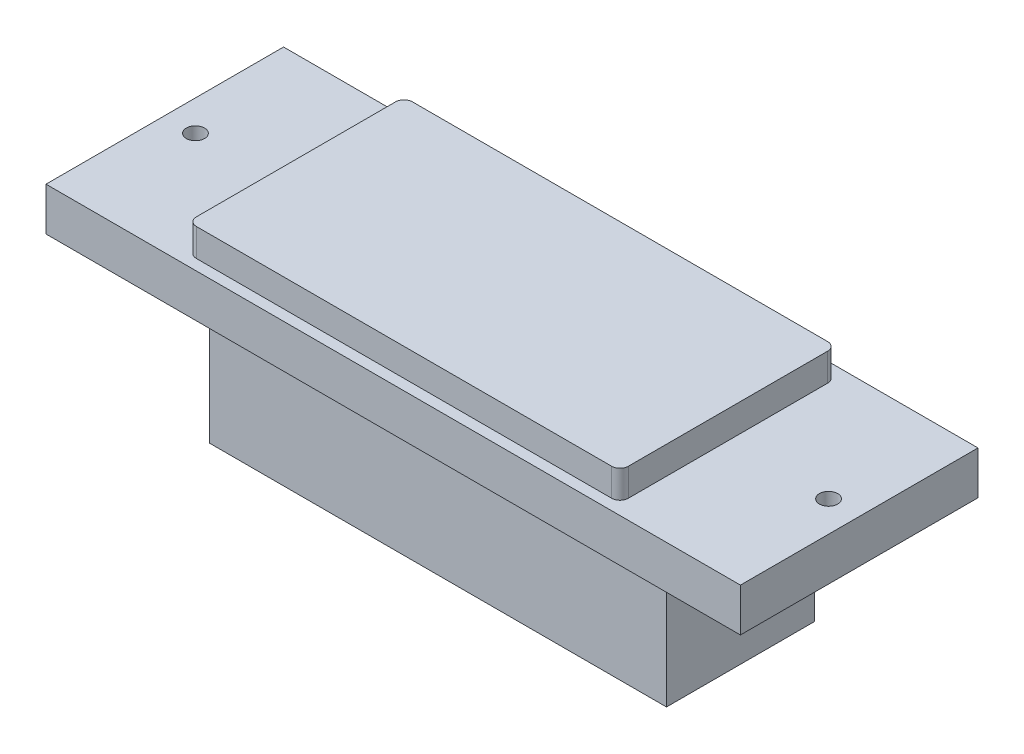
ISO-10303-21;
HEADER;
FILE_DESCRIPTION(('STEP AP214'),'2;1');
FILE_NAME('part.step','',(''),(''),'','','');
FILE_SCHEMA(('AUTOMOTIVE_DESIGN { 1 0 10303 214 1 1 1 1 }'));
ENDSEC;
DATA;
#1=APPLICATION_CONTEXT('core data for automotive mechanical design processes');
#2=APPLICATION_PROTOCOL_DEFINITION('international standard','automotive_design',2000,#1);
#3=PRODUCT_CONTEXT('',#1,'mechanical');
#4=PRODUCT('Part','Part','',(#3));
#5=PRODUCT_RELATED_PRODUCT_CATEGORY('part','',(#4));
#6=PRODUCT_DEFINITION_FORMATION('','',#4);
#7=PRODUCT_DEFINITION_CONTEXT('part definition',#1,'design');
#8=PRODUCT_DEFINITION('design','',#6,#7);
#9=PRODUCT_DEFINITION_SHAPE('','',#8);
#10=(LENGTH_UNIT() NAMED_UNIT(*) SI_UNIT(.MILLI.,.METRE.));
#11=(NAMED_UNIT(*) PLANE_ANGLE_UNIT() SI_UNIT($,.RADIAN.));
#12=(NAMED_UNIT(*) SI_UNIT($,.STERADIAN.) SOLID_ANGLE_UNIT());
#13=UNCERTAINTY_MEASURE_WITH_UNIT(LENGTH_MEASURE(1.E-05),#10,'distance_accuracy_value','');
#14=(GEOMETRIC_REPRESENTATION_CONTEXT(3) GLOBAL_UNCERTAINTY_ASSIGNED_CONTEXT((#13)) GLOBAL_UNIT_ASSIGNED_CONTEXT((#10,
#11,#12)) REPRESENTATION_CONTEXT('',''));
#15=CARTESIAN_POINT('',(0.,0.,0.));
#16=DIRECTION('',(0.,0.,1.));
#17=DIRECTION('',(1.,0.,0.));
#18=AXIS2_PLACEMENT_3D('',#15,#16,#17);
#19=CARTESIAN_POINT('',(0.,-6.604,0.));
#20=DIRECTION('',(0.,1.,0.));
#21=DIRECTION('',(0.,0.,1.));
#22=AXIS2_PLACEMENT_3D('',#19,#20,#21);
#23=PLANE('',#22);
#24=DIRECTION('',(0.,0.,-1.));
#25=VECTOR('',#24,1.);
#26=CARTESIAN_POINT('',(-53.086,-6.604,18.161));
#27=LINE('',#26,#25);
#28=CARTESIAN_POINT('',(-53.086,-6.604,18.161));
#29=VERTEX_POINT('',#28);
#30=CARTESIAN_POINT('',(-53.086,-6.604,-18.161));
#31=VERTEX_POINT('',#30);
#32=EDGE_CURVE('E184',#29,#31,#27,.T.);
#33=ORIENTED_EDGE('',*,*,#32,.T.);
#34=DIRECTION('',(1.,0.,0.));
#35=VECTOR('',#34,1.);
#36=CARTESIAN_POINT('',(53.086,-6.604,-18.161));
#37=LINE('',#36,#35);
#38=CARTESIAN_POINT('',(53.086,-6.604,-18.161));
#39=VERTEX_POINT('',#38);
#40=EDGE_CURVE('E187',#31,#39,#37,.T.);
#41=ORIENTED_EDGE('',*,*,#40,.T.);
#42=DIRECTION('',(0.,0.,1.));
#43=VECTOR('',#42,1.);
#44=CARTESIAN_POINT('',(53.086,-6.604,18.161));
#45=LINE('',#44,#43);
#46=CARTESIAN_POINT('',(53.086,-6.604,18.161));
#47=VERTEX_POINT('',#46);
#48=EDGE_CURVE('E190',#39,#47,#45,.T.);
#49=ORIENTED_EDGE('',*,*,#48,.T.);
#50=DIRECTION('',(-1.,0.,0.));
#51=VECTOR('',#50,1.);
#52=CARTESIAN_POINT('',(53.086,-6.604,18.161));
#53=LINE('',#52,#51);
#54=EDGE_CURVE('E192',#47,#29,#53,.T.);
#55=ORIENTED_EDGE('',*,*,#54,.T.);
#56=EDGE_LOOP('',(#33,#41,#49,#55));
#57=FACE_BOUND('',#56,.T.);
#58=CARTESIAN_POINT('',(48.3997,-6.604,0.));
#59=DIRECTION('',(0.,1.,0.));
#60=DIRECTION('',(0.,0.,1.));
#61=AXIS2_PLACEMENT_3D('',#58,#59,#60);
#62=CIRCLE('',#61,1.397);
#63=CARTESIAN_POINT('',(48.3997,-6.604,1.397));
#64=VERTEX_POINT('',#63);
#65=EDGE_CURVE('E180',#64,#64,#62,.T.);
#66=ORIENTED_EDGE('',*,*,#65,.T.);
#67=EDGE_LOOP('',(#66));
#68=FACE_BOUND('',#67,.T.);
#69=CARTESIAN_POINT('',(-48.3997,-6.604,0.));
#70=DIRECTION('',(0.,1.,0.));
#71=DIRECTION('',(0.,0.,1.));
#72=AXIS2_PLACEMENT_3D('',#69,#70,#71);
#73=CIRCLE('',#72,1.397);
#74=CARTESIAN_POINT('',(-48.3997,-6.604,1.397));
#75=VERTEX_POINT('',#74);
#76=EDGE_CURVE('E169',#75,#75,#73,.T.);
#77=ORIENTED_EDGE('',*,*,#76,.T.);
#78=EDGE_LOOP('',(#77));
#79=FACE_BOUND('',#78,.T.);
#80=DIRECTION('',(0.,0.,-1.));
#81=VECTOR('',#80,1.);
#82=CARTESIAN_POINT('',(-34.925,-6.604,11.303));
#83=LINE('',#82,#81);
#84=CARTESIAN_POINT('',(-34.925,-6.604,11.303));
#85=VERTEX_POINT('',#84);
#86=CARTESIAN_POINT('',(-34.925,-6.604,-11.303));
#87=VERTEX_POINT('',#86);
#88=EDGE_CURVE('E165',#85,#87,#83,.T.);
#89=ORIENTED_EDGE('',*,*,#88,.F.);
#90=DIRECTION('',(-1.,0.,0.));
#91=VECTOR('',#90,1.);
#92=CARTESIAN_POINT('',(34.925,-6.604,11.303));
#93=LINE('',#92,#91);
#94=CARTESIAN_POINT('',(34.925,-6.604,11.303));
#95=VERTEX_POINT('',#94);
#96=EDGE_CURVE('E162',#95,#85,#93,.T.);
#97=ORIENTED_EDGE('',*,*,#96,.F.);
#98=DIRECTION('',(0.,0.,1.));
#99=VECTOR('',#98,1.);
#100=CARTESIAN_POINT('',(34.925,-6.604,11.303));
#101=LINE('',#100,#99);
#102=CARTESIAN_POINT('',(34.925,-6.604,-11.303));
#103=VERTEX_POINT('',#102);
#104=EDGE_CURVE('E52',#103,#95,#101,.T.);
#105=ORIENTED_EDGE('',*,*,#104,.F.);
#106=DIRECTION('',(1.,0.,0.));
#107=VECTOR('',#106,1.);
#108=CARTESIAN_POINT('',(34.925,-6.604,-11.303));
#109=LINE('',#108,#107);
#110=EDGE_CURVE('E47',#87,#103,#109,.T.);
#111=ORIENTED_EDGE('',*,*,#110,.F.);
#112=EDGE_LOOP('',(#89,#97,#105,#111));
#113=FACE_BOUND('',#112,.T.);
#114=ADVANCED_FACE('F32',(#57,#68,#79,#113),#23,.F.);
#115=CARTESIAN_POINT('',(33.02,4.2418,-16.51));
#116=DIRECTION('',(-1.,0.,0.));
#117=DIRECTION('',(0.,0.,1.));
#118=AXIS2_PLACEMENT_3D('',#115,#116,#117);
#119=PLANE('',#118);
#120=DIRECTION('',(0.,0.,-1.));
#121=VECTOR('',#120,1.);
#122=CARTESIAN_POINT('',(33.02,4.2418,-16.51));
#123=LINE('',#122,#121);
#124=CARTESIAN_POINT('',(33.02,4.2418,15.24));
#125=VERTEX_POINT('',#124);
#126=CARTESIAN_POINT('',(33.02,4.2418,-15.24));
#127=VERTEX_POINT('',#126);
#128=EDGE_CURVE('E214',#125,#127,#123,.T.);
#129=ORIENTED_EDGE('',*,*,#128,.F.);
#130=DIRECTION('',(0.,-1.,0.));
#131=VECTOR('',#130,1.);
#132=CARTESIAN_POINT('',(33.02,4.2418,15.24));
#133=LINE('',#132,#131);
#134=CARTESIAN_POINT('',(33.02,0.,15.24));
#135=VERTEX_POINT('',#134);
#136=EDGE_CURVE('E236',#125,#135,#133,.T.);
#137=ORIENTED_EDGE('',*,*,#136,.T.);
#138=DIRECTION('',(0.,0.,-1.));
#139=VECTOR('',#138,1.);
#140=CARTESIAN_POINT('',(33.02,0.,-16.51));
#141=LINE('',#140,#139);
#142=CARTESIAN_POINT('',(33.02,0.,-15.24));
#143=VERTEX_POINT('',#142);
#144=EDGE_CURVE('E213',#135,#143,#141,.T.);
#145=ORIENTED_EDGE('',*,*,#144,.T.);
#146=DIRECTION('',(0.,-1.,0.));
#147=VECTOR('',#146,1.);
#148=CARTESIAN_POINT('',(33.02,4.2418,-15.24));
#149=LINE('',#148,#147);
#150=EDGE_CURVE('E227',#143,#127,#149,.F.);
#151=ORIENTED_EDGE('',*,*,#150,.T.);
#152=EDGE_LOOP('',(#129,#137,#145,#151));
#153=FACE_BOUND('',#152,.T.);
#154=ADVANCED_FACE('F294',(#153),#119,.F.);
#155=CARTESIAN_POINT('',(-33.02,4.2418,-16.51));
#156=DIRECTION('',(0.,0.,1.));
#157=DIRECTION('',(1.,0.,0.));
#158=AXIS2_PLACEMENT_3D('',#155,#156,#157);
#159=PLANE('',#158);
#160=DIRECTION('',(-1.,0.,0.));
#161=VECTOR('',#160,1.);
#162=CARTESIAN_POINT('',(-33.02,4.2418,-16.51));
#163=LINE('',#162,#161);
#164=CARTESIAN_POINT('',(31.75,4.2418,-16.51));
#165=VERTEX_POINT('',#164);
#166=CARTESIAN_POINT('',(-31.75,4.2418,-16.51));
#167=VERTEX_POINT('',#166);
#168=EDGE_CURVE('E217',#165,#167,#163,.T.);
#169=ORIENTED_EDGE('',*,*,#168,.F.);
#170=DIRECTION('',(0.,-1.,0.));
#171=VECTOR('',#170,1.);
#172=CARTESIAN_POINT('',(31.75,4.2418,-16.51));
#173=LINE('',#172,#171);
#174=CARTESIAN_POINT('',(31.75,0.,-16.51));
#175=VERTEX_POINT('',#174);
#176=EDGE_CURVE('E266',#165,#175,#173,.T.);
#177=ORIENTED_EDGE('',*,*,#176,.T.);
#178=DIRECTION('',(-1.,0.,0.));
#179=VECTOR('',#178,1.);
#180=CARTESIAN_POINT('',(-33.02,0.,-16.51));
#181=LINE('',#180,#179);
#182=CARTESIAN_POINT('',(-31.75,0.,-16.51));
#183=VERTEX_POINT('',#182);
#184=EDGE_CURVE('E230',#175,#183,#181,.T.);
#185=ORIENTED_EDGE('',*,*,#184,.T.);
#186=DIRECTION('',(0.,-1.,0.));
#187=VECTOR('',#186,1.);
#188=CARTESIAN_POINT('',(-31.75,4.2418,-16.51));
#189=LINE('',#188,#187);
#190=EDGE_CURVE('E264',#183,#167,#189,.F.);
#191=ORIENTED_EDGE('',*,*,#190,.T.);
#192=EDGE_LOOP('',(#169,#177,#185,#191));
#193=FACE_BOUND('',#192,.T.);
#194=ADVANCED_FACE('F302',(#193),#159,.F.);
#195=CARTESIAN_POINT('',(-33.02,4.2418,-16.51));
#196=DIRECTION('',(1.,0.,0.));
#197=DIRECTION('',(0.,0.,-1.));
#198=AXIS2_PLACEMENT_3D('',#195,#196,#197);
#199=PLANE('',#198);
#200=DIRECTION('',(0.,0.,1.));
#201=VECTOR('',#200,1.);
#202=CARTESIAN_POINT('',(-33.02,4.2418,-16.51));
#203=LINE('',#202,#201);
#204=CARTESIAN_POINT('',(-33.02,4.2418,-15.24));
#205=VERTEX_POINT('',#204);
#206=CARTESIAN_POINT('',(-33.02,4.2418,15.24));
#207=VERTEX_POINT('',#206);
#208=EDGE_CURVE('E221',#205,#207,#203,.T.);
#209=ORIENTED_EDGE('',*,*,#208,.F.);
#210=DIRECTION('',(0.,-1.,0.));
#211=VECTOR('',#210,1.);
#212=CARTESIAN_POINT('',(-33.02,4.2418,-15.24));
#213=LINE('',#212,#211);
#214=CARTESIAN_POINT('',(-33.02,0.,-15.24));
#215=VERTEX_POINT('',#214);
#216=EDGE_CURVE('E11',#205,#215,#213,.T.);
#217=ORIENTED_EDGE('',*,*,#216,.T.);
#218=DIRECTION('',(0.,0.,1.));
#219=VECTOR('',#218,1.);
#220=CARTESIAN_POINT('',(-33.02,0.,-16.51));
#221=LINE('',#220,#219);
#222=CARTESIAN_POINT('',(-33.02,0.,15.24));
#223=VERTEX_POINT('',#222);
#224=EDGE_CURVE('E232',#215,#223,#221,.T.);
#225=ORIENTED_EDGE('',*,*,#224,.T.);
#226=DIRECTION('',(0.,-1.,0.));
#227=VECTOR('',#226,1.);
#228=CARTESIAN_POINT('',(-33.02,4.2418,15.24));
#229=LINE('',#228,#227);
#230=EDGE_CURVE('E40',#223,#207,#229,.F.);
#231=ORIENTED_EDGE('',*,*,#230,.T.);
#232=EDGE_LOOP('',(#209,#217,#225,#231));
#233=FACE_BOUND('',#232,.T.);
#234=ADVANCED_FACE('F271',(#233),#199,.F.);
#235=CARTESIAN_POINT('',(-33.02,4.2418,16.51));
#236=DIRECTION('',(0.,0.,-1.));
#237=DIRECTION('',(-1.,0.,0.));
#238=AXIS2_PLACEMENT_3D('',#235,#236,#237);
#239=PLANE('',#238);
#240=DIRECTION('',(1.,0.,0.));
#241=VECTOR('',#240,1.);
#242=CARTESIAN_POINT('',(-33.02,0.,16.51));
#243=LINE('',#242,#241);
#244=CARTESIAN_POINT('',(-31.75,0.,16.51));
#245=VERTEX_POINT('',#244);
#246=CARTESIAN_POINT('',(31.75,0.,16.51));
#247=VERTEX_POINT('',#246);
#248=EDGE_CURVE('E218',#245,#247,#243,.T.);
#249=ORIENTED_EDGE('',*,*,#248,.T.);
#250=DIRECTION('',(0.,-1.,0.));
#251=VECTOR('',#250,1.);
#252=CARTESIAN_POINT('',(31.75,4.2418,16.51));
#253=LINE('',#252,#251);
#254=CARTESIAN_POINT('',(31.75,4.2418,16.51));
#255=VERTEX_POINT('',#254);
#256=EDGE_CURVE('E254',#247,#255,#253,.F.);
#257=ORIENTED_EDGE('',*,*,#256,.T.);
#258=DIRECTION('',(1.,0.,0.));
#259=VECTOR('',#258,1.);
#260=CARTESIAN_POINT('',(-33.02,4.2418,16.51));
#261=LINE('',#260,#259);
#262=CARTESIAN_POINT('',(-31.75,4.2418,16.51));
#263=VERTEX_POINT('',#262);
#264=EDGE_CURVE('E224',#263,#255,#261,.T.);
#265=ORIENTED_EDGE('',*,*,#264,.F.);
#266=DIRECTION('',(0.,-1.,0.));
#267=VECTOR('',#266,1.);
#268=CARTESIAN_POINT('',(-31.75,4.2418,16.51));
#269=LINE('',#268,#267);
#270=EDGE_CURVE('E251',#263,#245,#269,.T.);
#271=ORIENTED_EDGE('',*,*,#270,.T.);
#272=EDGE_LOOP('',(#249,#257,#265,#271));
#273=FACE_BOUND('',#272,.T.);
#274=ADVANCED_FACE('F283',(#273),#239,.F.);
#275=CARTESIAN_POINT('',(0.,4.2418,0.));
#276=DIRECTION('',(0.,1.,0.));
#277=DIRECTION('',(0.,0.,1.));
#278=AXIS2_PLACEMENT_3D('',#275,#276,#277);
#279=PLANE('',#278);
#280=ORIENTED_EDGE('',*,*,#264,.T.);
#281=CARTESIAN_POINT('',(31.75,4.2418,15.24));
#282=DIRECTION('',(0.,1.,0.));
#283=DIRECTION('',(0.,0.,1.));
#284=AXIS2_PLACEMENT_3D('',#281,#282,#283);
#285=CIRCLE('',#284,1.27);
#286=EDGE_CURVE('E262',#255,#125,#285,.T.);
#287=ORIENTED_EDGE('',*,*,#286,.T.);
#288=ORIENTED_EDGE('',*,*,#128,.T.);
#289=CARTESIAN_POINT('',(31.75,4.2418,-15.24));
#290=DIRECTION('',(0.,1.,0.));
#291=DIRECTION('',(0.,0.,1.));
#292=AXIS2_PLACEMENT_3D('',#289,#290,#291);
#293=CIRCLE('',#292,1.27);
#294=EDGE_CURVE('E260',#127,#165,#293,.T.);
#295=ORIENTED_EDGE('',*,*,#294,.T.);
#296=ORIENTED_EDGE('',*,*,#168,.T.);
#297=CARTESIAN_POINT('',(-31.75,4.2418,-15.24));
#298=DIRECTION('',(0.,1.,0.));
#299=DIRECTION('',(0.,0.,1.));
#300=AXIS2_PLACEMENT_3D('',#297,#298,#299);
#301=CIRCLE('',#300,1.27);
#302=EDGE_CURVE('E258',#167,#205,#301,.T.);
#303=ORIENTED_EDGE('',*,*,#302,.T.);
#304=ORIENTED_EDGE('',*,*,#208,.T.);
#305=CARTESIAN_POINT('',(-31.75,4.2418,15.24));
#306=DIRECTION('',(0.,1.,0.));
#307=DIRECTION('',(0.,0.,1.));
#308=AXIS2_PLACEMENT_3D('',#305,#306,#307);
#309=CIRCLE('',#308,1.27);
#310=EDGE_CURVE('E256',#207,#263,#309,.T.);
#311=ORIENTED_EDGE('',*,*,#310,.T.);
#312=EDGE_LOOP('',(#280,#287,#288,#295,#296,#303,#304,#311));
#313=FACE_BOUND('',#312,.T.);
#314=ADVANCED_FACE('F277',(#313),#279,.T.);
#315=CARTESIAN_POINT('',(31.75,4.2418,15.24));
#316=DIRECTION('',(0.,-1.,0.));
#317=DIRECTION('',(0.,0.,-1.));
#318=AXIS2_PLACEMENT_3D('',#315,#316,#317);
#319=CYLINDRICAL_SURFACE('',#318,1.27);
#320=ORIENTED_EDGE('',*,*,#286,.F.);
#321=ORIENTED_EDGE('',*,*,#256,.F.);
#322=CARTESIAN_POINT('',(31.75,0.,15.24));
#323=DIRECTION('',(0.,1.,0.));
#324=DIRECTION('',(0.,0.,1.));
#325=AXIS2_PLACEMENT_3D('',#322,#323,#324);
#326=CIRCLE('',#325,1.27);
#327=EDGE_CURVE('E248',#135,#247,#326,.F.);
#328=ORIENTED_EDGE('',*,*,#327,.F.);
#329=ORIENTED_EDGE('',*,*,#136,.F.);
#330=EDGE_LOOP('',(#320,#321,#328,#329));
#331=FACE_BOUND('',#330,.T.);
#332=ADVANCED_FACE('F291',(#331),#319,.T.);
#333=CARTESIAN_POINT('',(31.75,4.2418,-15.24));
#334=DIRECTION('',(0.,-1.,0.));
#335=DIRECTION('',(0.,0.,-1.));
#336=AXIS2_PLACEMENT_3D('',#333,#334,#335);
#337=CYLINDRICAL_SURFACE('',#336,1.27);
#338=ORIENTED_EDGE('',*,*,#294,.F.);
#339=ORIENTED_EDGE('',*,*,#150,.F.);
#340=CARTESIAN_POINT('',(31.75,0.,-15.24));
#341=DIRECTION('',(0.,1.,0.));
#342=DIRECTION('',(0.,0.,1.));
#343=AXIS2_PLACEMENT_3D('',#340,#341,#342);
#344=CIRCLE('',#343,1.27);
#345=EDGE_CURVE('E245',#175,#143,#344,.F.);
#346=ORIENTED_EDGE('',*,*,#345,.F.);
#347=ORIENTED_EDGE('',*,*,#176,.F.);
#348=EDGE_LOOP('',(#338,#339,#346,#347));
#349=FACE_BOUND('',#348,.T.);
#350=ADVANCED_FACE('F299',(#349),#337,.T.);
#351=CARTESIAN_POINT('',(-31.75,4.2418,-15.24));
#352=DIRECTION('',(0.,-1.,0.));
#353=DIRECTION('',(0.,0.,-1.));
#354=AXIS2_PLACEMENT_3D('',#351,#352,#353);
#355=CYLINDRICAL_SURFACE('',#354,1.27);
#356=ORIENTED_EDGE('',*,*,#302,.F.);
#357=ORIENTED_EDGE('',*,*,#190,.F.);
#358=CARTESIAN_POINT('',(-31.75,0.,-15.24));
#359=DIRECTION('',(0.,1.,0.));
#360=DIRECTION('',(0.,0.,1.));
#361=AXIS2_PLACEMENT_3D('',#358,#359,#360);
#362=CIRCLE('',#361,1.27);
#363=EDGE_CURVE('E242',#215,#183,#362,.F.);
#364=ORIENTED_EDGE('',*,*,#363,.F.);
#365=ORIENTED_EDGE('',*,*,#216,.F.);
#366=EDGE_LOOP('',(#356,#357,#364,#365));
#367=FACE_BOUND('',#366,.T.);
#368=ADVANCED_FACE('F305',(#367),#355,.T.);
#369=CARTESIAN_POINT('',(-31.75,4.2418,15.24));
#370=DIRECTION('',(0.,-1.,0.));
#371=DIRECTION('',(0.,0.,-1.));
#372=AXIS2_PLACEMENT_3D('',#369,#370,#371);
#373=CYLINDRICAL_SURFACE('',#372,1.27);
#374=ORIENTED_EDGE('',*,*,#310,.F.);
#375=ORIENTED_EDGE('',*,*,#230,.F.);
#376=CARTESIAN_POINT('',(-31.75,0.,15.24));
#377=DIRECTION('',(0.,1.,0.));
#378=DIRECTION('',(0.,0.,1.));
#379=AXIS2_PLACEMENT_3D('',#376,#377,#378);
#380=CIRCLE('',#379,1.27);
#381=EDGE_CURVE('E239',#245,#223,#380,.F.);
#382=ORIENTED_EDGE('',*,*,#381,.F.);
#383=ORIENTED_EDGE('',*,*,#270,.F.);
#384=EDGE_LOOP('',(#374,#375,#382,#383));
#385=FACE_BOUND('',#384,.T.);
#386=ADVANCED_FACE('F34',(#385),#373,.T.);
#387=CARTESIAN_POINT('',(0.,0.,0.));
#388=DIRECTION('',(0.,1.,0.));
#389=DIRECTION('',(0.,0.,1.));
#390=AXIS2_PLACEMENT_3D('',#387,#388,#389);
#391=PLANE('',#390);
#392=CARTESIAN_POINT('',(-48.3997,0.,0.));
#393=DIRECTION('',(0.,1.,0.));
#394=DIRECTION('',(0.,0.,1.));
#395=AXIS2_PLACEMENT_3D('',#392,#393,#394);
#396=CIRCLE('',#395,1.397);
#397=CARTESIAN_POINT('',(-48.3997,0.,1.397));
#398=VERTEX_POINT('',#397);
#399=EDGE_CURVE('E166',#398,#398,#396,.T.);
#400=ORIENTED_EDGE('',*,*,#399,.F.);
#401=EDGE_LOOP('',(#400));
#402=FACE_BOUND('',#401,.T.);
#403=CARTESIAN_POINT('',(48.3997,0.,0.));
#404=DIRECTION('',(0.,1.,0.));
#405=DIRECTION('',(0.,0.,1.));
#406=AXIS2_PLACEMENT_3D('',#403,#404,#405);
#407=CIRCLE('',#406,1.397);
#408=CARTESIAN_POINT('',(48.3997,0.,1.397));
#409=VERTEX_POINT('',#408);
#410=EDGE_CURVE('E177',#409,#409,#407,.T.);
#411=ORIENTED_EDGE('',*,*,#410,.F.);
#412=EDGE_LOOP('',(#411));
#413=FACE_BOUND('',#412,.T.);
#414=DIRECTION('',(0.,0.,-1.));
#415=VECTOR('',#414,1.);
#416=CARTESIAN_POINT('',(-53.086,0.,18.161));
#417=LINE('',#416,#415);
#418=CARTESIAN_POINT('',(-53.086,0.,18.161));
#419=VERTEX_POINT('',#418);
#420=CARTESIAN_POINT('',(-53.086,0.,-18.161));
#421=VERTEX_POINT('',#420);
#422=EDGE_CURVE('E183',#419,#421,#417,.T.);
#423=ORIENTED_EDGE('',*,*,#422,.F.);
#424=DIRECTION('',(-1.,0.,0.));
#425=VECTOR('',#424,1.);
#426=CARTESIAN_POINT('',(53.086,0.,18.161));
#427=LINE('',#426,#425);
#428=CARTESIAN_POINT('',(53.086,0.,18.161));
#429=VERTEX_POINT('',#428);
#430=EDGE_CURVE('E188',#429,#419,#427,.T.);
#431=ORIENTED_EDGE('',*,*,#430,.F.);
#432=DIRECTION('',(0.,0.,1.));
#433=VECTOR('',#432,1.);
#434=CARTESIAN_POINT('',(53.086,0.,18.161));
#435=LINE('',#434,#433);
#436=CARTESIAN_POINT('',(53.086,0.,-18.161));
#437=VERTEX_POINT('',#436);
#438=EDGE_CURVE('E199',#437,#429,#435,.T.);
#439=ORIENTED_EDGE('',*,*,#438,.F.);
#440=DIRECTION('',(1.,0.,0.));
#441=VECTOR('',#440,1.);
#442=CARTESIAN_POINT('',(53.086,0.,-18.161));
#443=LINE('',#442,#441);
#444=EDGE_CURVE('E197',#421,#437,#443,.T.);
#445=ORIENTED_EDGE('',*,*,#444,.F.);
#446=EDGE_LOOP('',(#423,#431,#439,#445));
#447=FACE_BOUND('',#446,.T.);
#448=ORIENTED_EDGE('',*,*,#144,.F.);
#449=ORIENTED_EDGE('',*,*,#327,.T.);
#450=ORIENTED_EDGE('',*,*,#248,.F.);
#451=ORIENTED_EDGE('',*,*,#381,.T.);
#452=ORIENTED_EDGE('',*,*,#224,.F.);
#453=ORIENTED_EDGE('',*,*,#363,.T.);
#454=ORIENTED_EDGE('',*,*,#184,.F.);
#455=ORIENTED_EDGE('',*,*,#345,.T.);
#456=EDGE_LOOP('',(#448,#449,#450,#451,#452,#453,#454,#455));
#457=FACE_BOUND('',#456,.T.);
#458=ADVANCED_FACE('F287',(#402,#413,#447,#457),#391,.T.);
#459=CARTESIAN_POINT('',(-53.086,-6.604,18.161));
#460=DIRECTION('',(1.,0.,0.));
#461=DIRECTION('',(0.,0.,-1.));
#462=AXIS2_PLACEMENT_3D('',#459,#460,#461);
#463=PLANE('',#462);
#464=ORIENTED_EDGE('',*,*,#422,.T.);
#465=DIRECTION('',(0.,1.,0.));
#466=VECTOR('',#465,1.);
#467=CARTESIAN_POINT('',(-53.086,-6.604,-18.161));
#468=LINE('',#467,#466);
#469=EDGE_CURVE('E210',#31,#421,#468,.T.);
#470=ORIENTED_EDGE('',*,*,#469,.F.);
#471=ORIENTED_EDGE('',*,*,#32,.F.);
#472=DIRECTION('',(0.,1.,0.));
#473=VECTOR('',#472,1.);
#474=CARTESIAN_POINT('',(-53.086,-6.604,18.161));
#475=LINE('',#474,#473);
#476=EDGE_CURVE('E194',#29,#419,#475,.T.);
#477=ORIENTED_EDGE('',*,*,#476,.T.);
#478=EDGE_LOOP('',(#464,#470,#471,#477));
#479=FACE_BOUND('',#478,.T.);
#480=ADVANCED_FACE('F326',(#479),#463,.F.);
#481=CARTESIAN_POINT('',(53.086,-6.604,-18.161));
#482=DIRECTION('',(0.,0.,1.));
#483=DIRECTION('',(1.,0.,0.));
#484=AXIS2_PLACEMENT_3D('',#481,#482,#483);
#485=PLANE('',#484);
#486=ORIENTED_EDGE('',*,*,#444,.T.);
#487=DIRECTION('',(0.,1.,0.));
#488=VECTOR('',#487,1.);
#489=CARTESIAN_POINT('',(53.086,-6.604,-18.161));
#490=LINE('',#489,#488);
#491=EDGE_CURVE('E207',#39,#437,#490,.T.);
#492=ORIENTED_EDGE('',*,*,#491,.F.);
#493=ORIENTED_EDGE('',*,*,#40,.F.);
#494=ORIENTED_EDGE('',*,*,#469,.T.);
#495=EDGE_LOOP('',(#486,#492,#493,#494));
#496=FACE_BOUND('',#495,.T.);
#497=ADVANCED_FACE('F335',(#496),#485,.F.);
#498=CARTESIAN_POINT('',(53.086,-6.604,18.161));
#499=DIRECTION('',(-1.,0.,0.));
#500=DIRECTION('',(0.,0.,1.));
#501=AXIS2_PLACEMENT_3D('',#498,#499,#500);
#502=PLANE('',#501);
#503=ORIENTED_EDGE('',*,*,#438,.T.);
#504=DIRECTION('',(0.,1.,0.));
#505=VECTOR('',#504,1.);
#506=CARTESIAN_POINT('',(53.086,-6.604,18.161));
#507=LINE('',#506,#505);
#508=EDGE_CURVE('E204',#47,#429,#507,.T.);
#509=ORIENTED_EDGE('',*,*,#508,.F.);
#510=ORIENTED_EDGE('',*,*,#48,.F.);
#511=ORIENTED_EDGE('',*,*,#491,.T.);
#512=EDGE_LOOP('',(#503,#509,#510,#511));
#513=FACE_BOUND('',#512,.T.);
#514=ADVANCED_FACE('F331',(#513),#502,.F.);
#515=CARTESIAN_POINT('',(53.086,-6.604,18.161));
#516=DIRECTION('',(0.,0.,-1.));
#517=DIRECTION('',(-1.,0.,0.));
#518=AXIS2_PLACEMENT_3D('',#515,#516,#517);
#519=PLANE('',#518);
#520=ORIENTED_EDGE('',*,*,#430,.T.);
#521=ORIENTED_EDGE('',*,*,#476,.F.);
#522=ORIENTED_EDGE('',*,*,#54,.F.);
#523=ORIENTED_EDGE('',*,*,#508,.T.);
#524=EDGE_LOOP('',(#520,#521,#522,#523));
#525=FACE_BOUND('',#524,.T.);
#526=ADVANCED_FACE('F328',(#525),#519,.F.);
#527=CARTESIAN_POINT('',(48.3997,0.,0.));
#528=DIRECTION('',(0.,1.,0.));
#529=DIRECTION('',(0.,0.,1.));
#530=AXIS2_PLACEMENT_3D('',#527,#528,#529);
#531=CYLINDRICAL_SURFACE('',#530,1.397);
#532=ORIENTED_EDGE('',*,*,#65,.F.);
#533=EDGE_LOOP('',(#532));
#534=FACE_BOUND('',#533,.T.);
#535=ORIENTED_EDGE('',*,*,#410,.T.);
#536=EDGE_LOOP('',(#535));
#537=FACE_BOUND('',#536,.T.);
#538=ADVANCED_FACE('F322',(#534,#537),#531,.F.);
#539=CARTESIAN_POINT('',(-48.3997,0.,0.));
#540=DIRECTION('',(0.,1.,0.));
#541=DIRECTION('',(0.,0.,1.));
#542=AXIS2_PLACEMENT_3D('',#539,#540,#541);
#543=CYLINDRICAL_SURFACE('',#542,1.397);
#544=ORIENTED_EDGE('',*,*,#76,.F.);
#545=EDGE_LOOP('',(#544));
#546=FACE_BOUND('',#545,.T.);
#547=ORIENTED_EDGE('',*,*,#399,.T.);
#548=EDGE_LOOP('',(#547));
#549=FACE_BOUND('',#548,.T.);
#550=ADVANCED_FACE('F410',(#546,#549),#543,.F.);
#551=CARTESIAN_POINT('',(-34.925,-28.6512,11.303));
#552=DIRECTION('',(1.,0.,0.));
#553=DIRECTION('',(0.,0.,-1.));
#554=AXIS2_PLACEMENT_3D('',#551,#552,#553);
#555=PLANE('',#554);
#556=ORIENTED_EDGE('',*,*,#88,.T.);
#557=DIRECTION('',(0.,1.,0.));
#558=VECTOR('',#557,1.);
#559=CARTESIAN_POINT('',(-34.925,-28.6512,-11.303));
#560=LINE('',#559,#558);
#561=CARTESIAN_POINT('',(-34.925,-28.6512,-11.303));
#562=VERTEX_POINT('',#561);
#563=EDGE_CURVE('E146',#562,#87,#560,.T.);
#564=ORIENTED_EDGE('',*,*,#563,.F.);
#565=DIRECTION('',(0.,0.,-1.));
#566=VECTOR('',#565,1.);
#567=CARTESIAN_POINT('',(-34.925,-28.6512,11.303));
#568=LINE('',#567,#566);
#569=CARTESIAN_POINT('',(-34.925,-28.6512,11.303));
#570=VERTEX_POINT('',#569);
#571=EDGE_CURVE('E153',#570,#562,#568,.T.);
#572=ORIENTED_EDGE('',*,*,#571,.F.);
#573=DIRECTION('',(0.,1.,0.));
#574=VECTOR('',#573,1.);
#575=CARTESIAN_POINT('',(-34.925,-28.6512,11.303));
#576=LINE('',#575,#574);
#577=EDGE_CURVE('E472',#570,#85,#576,.T.);
#578=ORIENTED_EDGE('',*,*,#577,.T.);
#579=EDGE_LOOP('',(#556,#564,#572,#578));
#580=FACE_BOUND('',#579,.T.);
#581=ADVANCED_FACE('F164',(#580),#555,.F.);
#582=CARTESIAN_POINT('',(34.925,-28.6512,-11.303));
#583=DIRECTION('',(0.,0.,1.));
#584=DIRECTION('',(1.,0.,0.));
#585=AXIS2_PLACEMENT_3D('',#582,#583,#584);
#586=PLANE('',#585);
#587=ORIENTED_EDGE('',*,*,#110,.T.);
#588=DIRECTION('',(0.,1.,0.));
#589=VECTOR('',#588,1.);
#590=CARTESIAN_POINT('',(34.925,-28.6512,-11.303));
#591=LINE('',#590,#589);
#592=CARTESIAN_POINT('',(34.925,-28.6512,-11.303));
#593=VERTEX_POINT('',#592);
#594=EDGE_CURVE('E149',#593,#103,#591,.T.);
#595=ORIENTED_EDGE('',*,*,#594,.F.);
#596=DIRECTION('',(1.,0.,0.));
#597=VECTOR('',#596,1.);
#598=CARTESIAN_POINT('',(34.925,-28.6512,-11.303));
#599=LINE('',#598,#597);
#600=EDGE_CURVE('E142',#562,#593,#599,.T.);
#601=ORIENTED_EDGE('',*,*,#600,.F.);
#602=ORIENTED_EDGE('',*,*,#563,.T.);
#603=EDGE_LOOP('',(#587,#595,#601,#602));
#604=FACE_BOUND('',#603,.T.);
#605=ADVANCED_FACE('F144',(#604),#586,.F.);
#606=CARTESIAN_POINT('',(34.925,-28.6512,11.303));
#607=DIRECTION('',(-1.,0.,0.));
#608=DIRECTION('',(0.,0.,1.));
#609=AXIS2_PLACEMENT_3D('',#606,#607,#608);
#610=PLANE('',#609);
#611=ORIENTED_EDGE('',*,*,#104,.T.);
#612=DIRECTION('',(0.,1.,0.));
#613=VECTOR('',#612,1.);
#614=CARTESIAN_POINT('',(34.925,-28.6512,11.303));
#615=LINE('',#614,#613);
#616=CARTESIAN_POINT('',(34.925,-28.6512,11.303));
#617=VERTEX_POINT('',#616);
#618=EDGE_CURVE('E171',#617,#95,#615,.T.);
#619=ORIENTED_EDGE('',*,*,#618,.F.);
#620=DIRECTION('',(0.,0.,1.));
#621=VECTOR('',#620,1.);
#622=CARTESIAN_POINT('',(34.925,-28.6512,11.303));
#623=LINE('',#622,#621);
#624=EDGE_CURVE('E152',#593,#617,#623,.T.);
#625=ORIENTED_EDGE('',*,*,#624,.F.);
#626=ORIENTED_EDGE('',*,*,#594,.T.);
#627=EDGE_LOOP('',(#611,#619,#625,#626));
#628=FACE_BOUND('',#627,.T.);
#629=ADVANCED_FACE('F439',(#628),#610,.F.);
#630=CARTESIAN_POINT('',(34.925,-28.6512,11.303));
#631=DIRECTION('',(0.,0.,-1.));
#632=DIRECTION('',(-1.,0.,0.));
#633=AXIS2_PLACEMENT_3D('',#630,#631,#632);
#634=PLANE('',#633);
#635=ORIENTED_EDGE('',*,*,#96,.T.);
#636=ORIENTED_EDGE('',*,*,#577,.F.);
#637=DIRECTION('',(-1.,0.,0.));
#638=VECTOR('',#637,1.);
#639=CARTESIAN_POINT('',(34.925,-28.6512,11.303));
#640=LINE('',#639,#638);
#641=EDGE_CURVE('E158',#617,#570,#640,.T.);
#642=ORIENTED_EDGE('',*,*,#641,.F.);
#643=ORIENTED_EDGE('',*,*,#618,.T.);
#644=EDGE_LOOP('',(#635,#636,#642,#643));
#645=FACE_BOUND('',#644,.T.);
#646=ADVANCED_FACE('F448',(#645),#634,.F.);
#647=CARTESIAN_POINT('',(0.,-28.6512,0.));
#648=DIRECTION('',(0.,1.,0.));
#649=DIRECTION('',(0.,0.,1.));
#650=AXIS2_PLACEMENT_3D('',#647,#648,#649);
#651=PLANE('',#650);
#652=ORIENTED_EDGE('',*,*,#571,.T.);
#653=ORIENTED_EDGE('',*,*,#600,.T.);
#654=ORIENTED_EDGE('',*,*,#624,.T.);
#655=ORIENTED_EDGE('',*,*,#641,.T.);
#656=EDGE_LOOP('',(#652,#653,#654,#655));
#657=FACE_BOUND('',#656,.T.);
#658=ADVANCED_FACE('F156',(#657),#651,.F.);
#659=CLOSED_SHELL('',(#114,#154,#194,#234,#274,#314,#332,#350,#368,#386,#458,#480,#497,#514,
#526,#538,#550,#581,#605,#629,#646,#658));
#660=MANIFOLD_SOLID_BREP('B2',#659);
#661=ADVANCED_BREP_SHAPE_REPRESENTATION('',(#18,#660),#14);
#662=SHAPE_DEFINITION_REPRESENTATION(#9,#661);
ENDSEC;
END-ISO-10303-21;
